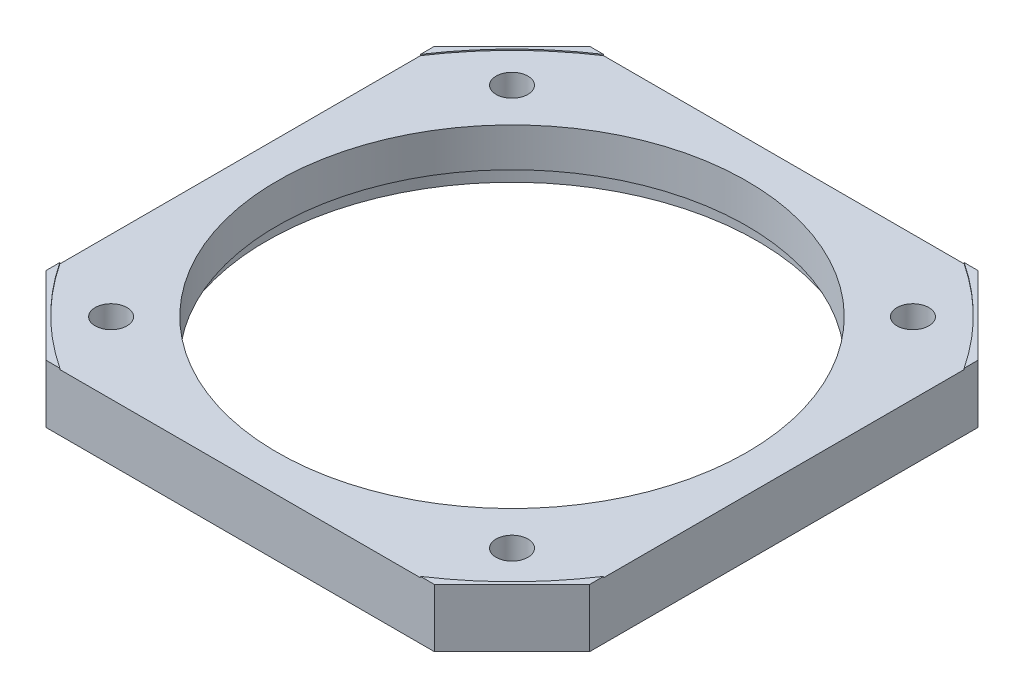
ISO-10303-21;
HEADER;
FILE_DESCRIPTION(('STEP AP214'),'2;1');
FILE_NAME('part.step','',(''),(''),'','','');
FILE_SCHEMA(('AUTOMOTIVE_DESIGN { 1 0 10303 214 1 1 1 1 }'));
ENDSEC;
DATA;
#1=APPLICATION_CONTEXT('core data for automotive mechanical design processes');
#2=APPLICATION_PROTOCOL_DEFINITION('international standard','automotive_design',2000,#1);
#3=PRODUCT_CONTEXT('',#1,'mechanical');
#4=PRODUCT('Part','Part','',(#3));
#5=PRODUCT_RELATED_PRODUCT_CATEGORY('part','',(#4));
#6=PRODUCT_DEFINITION_FORMATION('','',#4);
#7=PRODUCT_DEFINITION_CONTEXT('part definition',#1,'design');
#8=PRODUCT_DEFINITION('design','',#6,#7);
#9=PRODUCT_DEFINITION_SHAPE('','',#8);
#10=(LENGTH_UNIT() NAMED_UNIT(*) SI_UNIT(.MILLI.,.METRE.));
#11=(NAMED_UNIT(*) PLANE_ANGLE_UNIT() SI_UNIT($,.RADIAN.));
#12=(NAMED_UNIT(*) SI_UNIT($,.STERADIAN.) SOLID_ANGLE_UNIT());
#13=UNCERTAINTY_MEASURE_WITH_UNIT(LENGTH_MEASURE(1.E-05),#10,'distance_accuracy_value','');
#14=(GEOMETRIC_REPRESENTATION_CONTEXT(3) GLOBAL_UNCERTAINTY_ASSIGNED_CONTEXT((#13)) GLOBAL_UNIT_ASSIGNED_CONTEXT((#10,
#11,#12)) REPRESENTATION_CONTEXT('',''));
#15=CARTESIAN_POINT('',(0.,0.,0.));
#16=DIRECTION('',(0.,0.,1.));
#17=DIRECTION('',(1.,0.,0.));
#18=AXIS2_PLACEMENT_3D('',#15,#16,#17);
#19=CARTESIAN_POINT('',(144.,-7.2,-60.));
#20=DIRECTION('',(0.707106781186548,0.,-0.707106781186548));
#21=DIRECTION('',(0.,-1.,0.));
#22=AXIS2_PLACEMENT_3D('',#19,#20,#21);
#23=PLANE('',#22);
#24=DIRECTION('',(0.707106781186548,0.,0.707106781186548));
#25=VECTOR('',#24,1.);
#26=CARTESIAN_POINT('',(134.,-14.7,-70.));
#27=LINE('',#26,#25);
#28=CARTESIAN_POINT('',(134.,-14.7,-70.));
#29=VERTEX_POINT('',#28);
#30=CARTESIAN_POINT('',(154.,-14.7,-50.));
#31=VERTEX_POINT('',#30);
#32=EDGE_CURVE('E484',#29,#31,#27,.T.);
#33=ORIENTED_EDGE('',*,*,#32,.F.);
#34=DIRECTION('',(0.,-1.,0.));
#35=VECTOR('',#34,1.);
#36=CARTESIAN_POINT('',(134.,0.3,-70.));
#37=LINE('',#36,#35);
#38=CARTESIAN_POINT('',(134.,0.3,-70.));
#39=VERTEX_POINT('',#38);
#40=EDGE_CURVE('E335',#39,#29,#37,.T.);
#41=ORIENTED_EDGE('',*,*,#40,.F.);
#42=DIRECTION('',(-0.707106781186548,0.,-0.707106781186548));
#43=VECTOR('',#42,1.);
#44=CARTESIAN_POINT('',(154.,0.3,-50.));
#45=LINE('',#44,#43);
#46=CARTESIAN_POINT('',(154.,0.3,-50.));
#47=VERTEX_POINT('',#46);
#48=EDGE_CURVE('E352',#47,#39,#45,.T.);
#49=ORIENTED_EDGE('',*,*,#48,.F.);
#50=DIRECTION('',(0.,-1.,0.));
#51=VECTOR('',#50,1.);
#52=CARTESIAN_POINT('',(154.,0.3,-50.));
#53=LINE('',#52,#51);
#54=EDGE_CURVE('E28',#47,#31,#53,.T.);
#55=ORIENTED_EDGE('',*,*,#54,.T.);
#56=EDGE_LOOP('',(#33,#41,#49,#55));
#57=FACE_BOUND('',#56,.T.);
#58=ADVANCED_FACE('F17',(#57),#23,.T.);
#59=CARTESIAN_POINT('',(84.,-14.7,0.));
#60=DIRECTION('',(0.,1.,0.));
#61=DIRECTION('',(0.,0.,1.));
#62=AXIS2_PLACEMENT_3D('',#59,#60,#61);
#63=CYLINDRICAL_SURFACE('',#62,84.);
#64=CARTESIAN_POINT('',(84.,0.,0.));
#65=DIRECTION('',(0.,1.,0.));
#66=DIRECTION('',(0.833333333333308,0.,-0.552770798392605));
#67=AXIS2_PLACEMENT_3D('',#64,#65,#66);
#68=CIRCLE('',#67,84.);
#69=CARTESIAN_POINT('',(154.,0.,-46.43274706498));
#70=VERTEX_POINT('',#69);
#71=CARTESIAN_POINT('',(130.432747065,0.,-70.));
#72=VERTEX_POINT('',#71);
#73=EDGE_CURVE('E336',#70,#72,#68,.T.);
#74=ORIENTED_EDGE('',*,*,#73,.F.);
#75=DIRECTION('',(0.,1.,0.));
#76=VECTOR('',#75,1.);
#77=CARTESIAN_POINT('',(154.,0.,-46.43274706498));
#78=LINE('',#77,#76);
#79=CARTESIAN_POINT('',(154.,0.3,-46.43274706498));
#80=VERTEX_POINT('',#79);
#81=EDGE_CURVE('E11',#70,#80,#78,.T.);
#82=ORIENTED_EDGE('',*,*,#81,.T.);
#83=CARTESIAN_POINT('',(84.,0.3,0.));
#84=DIRECTION('',(0.,-1.,0.));
#85=DIRECTION('',(0.552770798392605,0.,-0.833333333333308));
#86=AXIS2_PLACEMENT_3D('',#83,#84,#85);
#87=CIRCLE('',#86,84.);
#88=CARTESIAN_POINT('',(130.432747065,0.3,-70.));
#89=VERTEX_POINT('',#88);
#90=EDGE_CURVE('E499',#89,#80,#87,.T.);
#91=ORIENTED_EDGE('',*,*,#90,.F.);
#92=DIRECTION('',(0.,1.,0.));
#93=VECTOR('',#92,1.);
#94=CARTESIAN_POINT('',(130.432747065,0.,-70.));
#95=LINE('',#94,#93);
#96=EDGE_CURVE('E417',#72,#89,#95,.T.);
#97=ORIENTED_EDGE('',*,*,#96,.F.);
#98=EDGE_LOOP('',(#74,#82,#91,#97));
#99=FACE_BOUND('',#98,.T.);
#100=ADVANCED_FACE('F912',(#99),#63,.F.);
#101=CARTESIAN_POINT('',(144.,-7.2,60.));
#102=DIRECTION('',(0.707106781186548,0.,0.707106781186548));
#103=DIRECTION('',(0.,-1.,0.));
#104=AXIS2_PLACEMENT_3D('',#101,#102,#103);
#105=PLANE('',#104);
#106=DIRECTION('',(-0.707106781186548,0.,0.707106781186548));
#107=VECTOR('',#106,1.);
#108=CARTESIAN_POINT('',(154.,-14.7,50.));
#109=LINE('',#108,#107);
#110=CARTESIAN_POINT('',(154.,-14.7,50.));
#111=VERTEX_POINT('',#110);
#112=CARTESIAN_POINT('',(134.,-14.7,70.));
#113=VERTEX_POINT('',#112);
#114=EDGE_CURVE('E383',#111,#113,#109,.T.);
#115=ORIENTED_EDGE('',*,*,#114,.F.);
#116=DIRECTION('',(0.,-1.,0.));
#117=VECTOR('',#116,1.);
#118=CARTESIAN_POINT('',(154.,0.3,50.));
#119=LINE('',#118,#117);
#120=CARTESIAN_POINT('',(154.,0.3,50.));
#121=VERTEX_POINT('',#120);
#122=EDGE_CURVE('E400',#121,#111,#119,.T.);
#123=ORIENTED_EDGE('',*,*,#122,.F.);
#124=DIRECTION('',(0.707106781186548,0.,-0.707106781186548));
#125=VECTOR('',#124,1.);
#126=CARTESIAN_POINT('',(134.,0.3,70.));
#127=LINE('',#126,#125);
#128=CARTESIAN_POINT('',(134.,0.3,70.));
#129=VERTEX_POINT('',#128);
#130=EDGE_CURVE('E326',#129,#121,#127,.T.);
#131=ORIENTED_EDGE('',*,*,#130,.F.);
#132=DIRECTION('',(0.,-1.,0.));
#133=VECTOR('',#132,1.);
#134=CARTESIAN_POINT('',(134.,0.3,70.));
#135=LINE('',#134,#133);
#136=EDGE_CURVE('E348',#129,#113,#135,.T.);
#137=ORIENTED_EDGE('',*,*,#136,.T.);
#138=EDGE_LOOP('',(#115,#123,#131,#137));
#139=FACE_BOUND('',#138,.T.);
#140=ADVANCED_FACE('F907',(#139),#105,.T.);
#141=CARTESIAN_POINT('',(154.,0.,-46.43274706498));
#142=DIRECTION('',(-1.,0.,0.));
#143=DIRECTION('',(0.,0.,1.));
#144=AXIS2_PLACEMENT_3D('',#141,#142,#143);
#145=PLANE('',#144);
#146=ORIENTED_EDGE('',*,*,#122,.T.);
#147=DIRECTION('',(0.,0.,1.));
#148=VECTOR('',#147,1.);
#149=CARTESIAN_POINT('',(154.,-14.7,-50.));
#150=LINE('',#149,#148);
#151=EDGE_CURVE('E387',#31,#111,#150,.T.);
#152=ORIENTED_EDGE('',*,*,#151,.F.);
#153=ORIENTED_EDGE('',*,*,#54,.F.);
#154=DIRECTION('',(0.,0.,-1.));
#155=VECTOR('',#154,1.);
#156=CARTESIAN_POINT('',(154.,0.3,-46.43274706498));
#157=LINE('',#156,#155);
#158=EDGE_CURVE('E300',#80,#47,#157,.T.);
#159=ORIENTED_EDGE('',*,*,#158,.F.);
#160=ORIENTED_EDGE('',*,*,#81,.F.);
#161=DIRECTION('',(0.,0.,1.));
#162=VECTOR('',#161,1.);
#163=CARTESIAN_POINT('',(154.,0.,-46.43274706498));
#164=LINE('',#163,#162);
#165=CARTESIAN_POINT('',(154.,0.,46.43274706498));
#166=VERTEX_POINT('',#165);
#167=EDGE_CURVE('E340',#70,#166,#164,.T.);
#168=ORIENTED_EDGE('',*,*,#167,.T.);
#169=DIRECTION('',(0.,1.,0.));
#170=VECTOR('',#169,1.);
#171=CARTESIAN_POINT('',(154.,0.,46.43274706498));
#172=LINE('',#171,#170);
#173=CARTESIAN_POINT('',(154.,0.3,46.43274706498));
#174=VERTEX_POINT('',#173);
#175=EDGE_CURVE('E403',#166,#174,#172,.T.);
#176=ORIENTED_EDGE('',*,*,#175,.T.);
#177=DIRECTION('',(0.,0.,-1.));
#178=VECTOR('',#177,1.);
#179=CARTESIAN_POINT('',(154.,0.3,50.));
#180=LINE('',#179,#178);
#181=EDGE_CURVE('E325',#121,#174,#180,.T.);
#182=ORIENTED_EDGE('',*,*,#181,.F.);
#183=EDGE_LOOP('',(#146,#152,#153,#159,#160,#168,#176,#182));
#184=FACE_BOUND('',#183,.T.);
#185=ADVANCED_FACE('F876',(#184),#145,.F.);
#186=CARTESIAN_POINT('',(84.,-14.7,0.));
#187=DIRECTION('',(0.,1.,0.));
#188=DIRECTION('',(0.,0.,1.));
#189=AXIS2_PLACEMENT_3D('',#186,#187,#188);
#190=CYLINDRICAL_SURFACE('',#189,84.);
#191=CARTESIAN_POINT('',(84.,0.,0.));
#192=DIRECTION('',(0.,1.,0.));
#193=DIRECTION('',(0.552770798392605,0.,0.833333333333308));
#194=AXIS2_PLACEMENT_3D('',#191,#192,#193);
#195=CIRCLE('',#194,84.);
#196=CARTESIAN_POINT('',(130.432747065,0.,70.));
#197=VERTEX_POINT('',#196);
#198=EDGE_CURVE('E503',#197,#166,#195,.T.);
#199=ORIENTED_EDGE('',*,*,#198,.F.);
#200=DIRECTION('',(0.,1.,0.));
#201=VECTOR('',#200,1.);
#202=CARTESIAN_POINT('',(130.432747065,0.,70.));
#203=LINE('',#202,#201);
#204=CARTESIAN_POINT('',(130.432747065,0.3,70.));
#205=VERTEX_POINT('',#204);
#206=EDGE_CURVE('E382',#197,#205,#203,.T.);
#207=ORIENTED_EDGE('',*,*,#206,.T.);
#208=CARTESIAN_POINT('',(84.,0.3,0.));
#209=DIRECTION('',(0.,-1.,0.));
#210=DIRECTION('',(0.833333333333308,0.,0.552770798392605));
#211=AXIS2_PLACEMENT_3D('',#208,#209,#210);
#212=CIRCLE('',#211,84.);
#213=EDGE_CURVE('E320',#174,#205,#212,.T.);
#214=ORIENTED_EDGE('',*,*,#213,.F.);
#215=ORIENTED_EDGE('',*,*,#175,.F.);
#216=EDGE_LOOP('',(#199,#207,#214,#215));
#217=FACE_BOUND('',#216,.T.);
#218=ADVANCED_FACE('F870',(#217),#190,.F.);
#219=CARTESIAN_POINT('',(24.,-7.2,60.));
#220=DIRECTION('',(-0.707106781186548,0.,0.707106781186548));
#221=DIRECTION('',(0.,1.,0.));
#222=AXIS2_PLACEMENT_3D('',#219,#220,#221);
#223=PLANE('',#222);
#224=DIRECTION('',(-0.707106781186548,0.,-0.707106781186548));
#225=VECTOR('',#224,1.);
#226=CARTESIAN_POINT('',(34.,-14.7,70.));
#227=LINE('',#226,#225);
#228=CARTESIAN_POINT('',(34.,-14.7,70.));
#229=VERTEX_POINT('',#228);
#230=CARTESIAN_POINT('',(14.,-14.7,50.));
#231=VERTEX_POINT('',#230);
#232=EDGE_CURVE('E366',#229,#231,#227,.T.);
#233=ORIENTED_EDGE('',*,*,#232,.F.);
#234=DIRECTION('',(0.,-1.,0.));
#235=VECTOR('',#234,1.);
#236=CARTESIAN_POINT('',(34.,0.3,70.));
#237=LINE('',#236,#235);
#238=CARTESIAN_POINT('',(34.,0.3,70.));
#239=VERTEX_POINT('',#238);
#240=EDGE_CURVE('E344',#239,#229,#237,.T.);
#241=ORIENTED_EDGE('',*,*,#240,.F.);
#242=DIRECTION('',(0.707106781186548,0.,0.707106781186548));
#243=VECTOR('',#242,1.);
#244=CARTESIAN_POINT('',(14.,0.3,50.));
#245=LINE('',#244,#243);
#246=CARTESIAN_POINT('',(14.,0.3,50.));
#247=VERTEX_POINT('',#246);
#248=EDGE_CURVE('E375',#247,#239,#245,.T.);
#249=ORIENTED_EDGE('',*,*,#248,.F.);
#250=DIRECTION('',(0.,-1.,0.));
#251=VECTOR('',#250,1.);
#252=CARTESIAN_POINT('',(14.,0.3,50.));
#253=LINE('',#252,#251);
#254=EDGE_CURVE('E299',#247,#231,#253,.T.);
#255=ORIENTED_EDGE('',*,*,#254,.T.);
#256=EDGE_LOOP('',(#233,#241,#249,#255));
#257=FACE_BOUND('',#256,.T.);
#258=ADVANCED_FACE('F875',(#257),#223,.T.);
#259=CARTESIAN_POINT('',(130.432747065,0.,70.));
#260=DIRECTION('',(0.,0.,-1.));
#261=DIRECTION('',(0.,-1.,0.));
#262=AXIS2_PLACEMENT_3D('',#259,#260,#261);
#263=PLANE('',#262);
#264=ORIENTED_EDGE('',*,*,#240,.T.);
#265=DIRECTION('',(-1.,0.,0.));
#266=VECTOR('',#265,1.);
#267=CARTESIAN_POINT('',(134.,-14.7,70.));
#268=LINE('',#267,#266);
#269=EDGE_CURVE('E371',#113,#229,#268,.T.);
#270=ORIENTED_EDGE('',*,*,#269,.F.);
#271=ORIENTED_EDGE('',*,*,#136,.F.);
#272=DIRECTION('',(1.,0.,0.));
#273=VECTOR('',#272,1.);
#274=CARTESIAN_POINT('',(130.432747065,0.3,70.));
#275=LINE('',#274,#273);
#276=EDGE_CURVE('E324',#205,#129,#275,.T.);
#277=ORIENTED_EDGE('',*,*,#276,.F.);
#278=ORIENTED_EDGE('',*,*,#206,.F.);
#279=DIRECTION('',(-1.,0.,0.));
#280=VECTOR('',#279,1.);
#281=CARTESIAN_POINT('',(130.432747065,0.,70.));
#282=LINE('',#281,#280);
#283=CARTESIAN_POINT('',(37.56725293502,0.,70.));
#284=VERTEX_POINT('',#283);
#285=EDGE_CURVE('E294',#197,#284,#282,.T.);
#286=ORIENTED_EDGE('',*,*,#285,.T.);
#287=DIRECTION('',(0.,1.,0.));
#288=VECTOR('',#287,1.);
#289=CARTESIAN_POINT('',(37.56725293502,0.,70.));
#290=LINE('',#289,#288);
#291=CARTESIAN_POINT('',(37.56725293502,0.3,70.));
#292=VERTEX_POINT('',#291);
#293=EDGE_CURVE('E74',#284,#292,#290,.T.);
#294=ORIENTED_EDGE('',*,*,#293,.T.);
#295=DIRECTION('',(1.,0.,0.));
#296=VECTOR('',#295,1.);
#297=CARTESIAN_POINT('',(34.,0.3,70.));
#298=LINE('',#297,#296);
#299=EDGE_CURVE('E394',#239,#292,#298,.T.);
#300=ORIENTED_EDGE('',*,*,#299,.F.);
#301=EDGE_LOOP('',(#264,#270,#271,#277,#278,#286,#294,#300));
#302=FACE_BOUND('',#301,.T.);
#303=ADVANCED_FACE('F932',(#302),#263,.F.);
#304=CARTESIAN_POINT('',(84.,-14.7,0.));
#305=DIRECTION('',(0.,1.,0.));
#306=DIRECTION('',(0.,0.,1.));
#307=AXIS2_PLACEMENT_3D('',#304,#305,#306);
#308=CYLINDRICAL_SURFACE('',#307,84.);
#309=CARTESIAN_POINT('',(84.,0.,0.));
#310=DIRECTION('',(0.,1.,0.));
#311=DIRECTION('',(-0.833333333333308,0.,0.552770798392605));
#312=AXIS2_PLACEMENT_3D('',#309,#310,#311);
#313=CIRCLE('',#312,84.);
#314=CARTESIAN_POINT('',(14.,0.,46.43274706498));
#315=VERTEX_POINT('',#314);
#316=EDGE_CURVE('E432',#315,#284,#313,.T.);
#317=ORIENTED_EDGE('',*,*,#316,.F.);
#318=DIRECTION('',(0.,1.,0.));
#319=VECTOR('',#318,1.);
#320=CARTESIAN_POINT('',(14.,0.,46.43274706498));
#321=LINE('',#320,#319);
#322=CARTESIAN_POINT('',(14.,0.3,46.43274706498));
#323=VERTEX_POINT('',#322);
#324=EDGE_CURVE('E90',#315,#323,#321,.T.);
#325=ORIENTED_EDGE('',*,*,#324,.T.);
#326=CARTESIAN_POINT('',(84.,0.3,0.));
#327=DIRECTION('',(0.,-1.,0.));
#328=DIRECTION('',(-0.552770798392605,0.,0.833333333333308));
#329=AXIS2_PLACEMENT_3D('',#326,#327,#328);
#330=CIRCLE('',#329,84.);
#331=EDGE_CURVE('E21',#292,#323,#330,.T.);
#332=ORIENTED_EDGE('',*,*,#331,.F.);
#333=ORIENTED_EDGE('',*,*,#293,.F.);
#334=EDGE_LOOP('',(#317,#325,#332,#333));
#335=FACE_BOUND('',#334,.T.);
#336=ADVANCED_FACE('F937',(#335),#308,.F.);
#337=CARTESIAN_POINT('',(14.,0.,46.43274706498));
#338=DIRECTION('',(1.,0.,0.));
#339=DIRECTION('',(0.,1.,0.));
#340=AXIS2_PLACEMENT_3D('',#337,#338,#339);
#341=PLANE('',#340);
#342=DIRECTION('',(0.,-1.,0.));
#343=VECTOR('',#342,1.);
#344=CARTESIAN_POINT('',(14.,0.3,-50.));
#345=LINE('',#344,#343);
#346=CARTESIAN_POINT('',(14.,0.3,-50.));
#347=VERTEX_POINT('',#346);
#348=CARTESIAN_POINT('',(14.,-14.7,-50.));
#349=VERTEX_POINT('',#348);
#350=EDGE_CURVE('E331',#347,#349,#345,.T.);
#351=ORIENTED_EDGE('',*,*,#350,.T.);
#352=DIRECTION('',(0.,0.,-1.));
#353=VECTOR('',#352,1.);
#354=CARTESIAN_POINT('',(14.,-14.7,50.));
#355=LINE('',#354,#353);
#356=EDGE_CURVE('E370',#231,#349,#355,.T.);
#357=ORIENTED_EDGE('',*,*,#356,.F.);
#358=ORIENTED_EDGE('',*,*,#254,.F.);
#359=DIRECTION('',(0.,0.,1.));
#360=VECTOR('',#359,1.);
#361=CARTESIAN_POINT('',(14.,0.3,46.43274706498));
#362=LINE('',#361,#360);
#363=EDGE_CURVE('E330',#323,#247,#362,.T.);
#364=ORIENTED_EDGE('',*,*,#363,.F.);
#365=ORIENTED_EDGE('',*,*,#324,.F.);
#366=DIRECTION('',(0.,0.,-1.));
#367=VECTOR('',#366,1.);
#368=CARTESIAN_POINT('',(14.,0.,46.43274706498));
#369=LINE('',#368,#367);
#370=CARTESIAN_POINT('',(14.,0.,-46.43274706498));
#371=VERTEX_POINT('',#370);
#372=EDGE_CURVE('E409',#315,#371,#369,.T.);
#373=ORIENTED_EDGE('',*,*,#372,.T.);
#374=DIRECTION('',(0.,1.,0.));
#375=VECTOR('',#374,1.);
#376=CARTESIAN_POINT('',(14.,0.,-46.43274706498));
#377=LINE('',#376,#375);
#378=CARTESIAN_POINT('',(14.,0.3,-46.43274706498));
#379=VERTEX_POINT('',#378);
#380=EDGE_CURVE('E296',#371,#379,#377,.T.);
#381=ORIENTED_EDGE('',*,*,#380,.T.);
#382=DIRECTION('',(0.,0.,1.));
#383=VECTOR('',#382,1.);
#384=CARTESIAN_POINT('',(14.,0.3,-50.));
#385=LINE('',#384,#383);
#386=EDGE_CURVE('E376',#347,#379,#385,.T.);
#387=ORIENTED_EDGE('',*,*,#386,.F.);
#388=EDGE_LOOP('',(#351,#357,#358,#364,#365,#373,#381,#387));
#389=FACE_BOUND('',#388,.T.);
#390=ADVANCED_FACE('F845',(#389),#341,.F.);
#391=CARTESIAN_POINT('',(84.,-14.7,0.));
#392=DIRECTION('',(0.,1.,0.));
#393=DIRECTION('',(0.,0.,1.));
#394=AXIS2_PLACEMENT_3D('',#391,#392,#393);
#395=CYLINDRICAL_SURFACE('',#394,84.);
#396=CARTESIAN_POINT('',(84.,0.,0.));
#397=DIRECTION('',(0.,1.,0.));
#398=DIRECTION('',(-0.552770798392605,0.,-0.833333333333308));
#399=AXIS2_PLACEMENT_3D('',#396,#397,#398);
#400=CIRCLE('',#399,84.);
#401=CARTESIAN_POINT('',(37.56725293502,0.,-70.));
#402=VERTEX_POINT('',#401);
#403=EDGE_CURVE('E362',#402,#371,#400,.T.);
#404=ORIENTED_EDGE('',*,*,#403,.F.);
#405=DIRECTION('',(0.,1.,0.));
#406=VECTOR('',#405,1.);
#407=CARTESIAN_POINT('',(37.56725293502,0.,-70.));
#408=LINE('',#407,#406);
#409=CARTESIAN_POINT('',(37.56725293502,0.3,-70.));
#410=VERTEX_POINT('',#409);
#411=EDGE_CURVE('E413',#402,#410,#408,.T.);
#412=ORIENTED_EDGE('',*,*,#411,.T.);
#413=CARTESIAN_POINT('',(84.,0.3,0.));
#414=DIRECTION('',(0.,-1.,0.));
#415=DIRECTION('',(-0.833333333333308,0.,-0.552770798392605));
#416=AXIS2_PLACEMENT_3D('',#413,#414,#415);
#417=CIRCLE('',#416,84.);
#418=EDGE_CURVE('E372',#379,#410,#417,.T.);
#419=ORIENTED_EDGE('',*,*,#418,.F.);
#420=ORIENTED_EDGE('',*,*,#380,.F.);
#421=EDGE_LOOP('',(#404,#412,#419,#420));
#422=FACE_BOUND('',#421,.T.);
#423=ADVANCED_FACE('F840',(#422),#395,.F.);
#424=CARTESIAN_POINT('',(84.,0.3,0.));
#425=DIRECTION('',(0.,1.,0.));
#426=DIRECTION('',(1.,0.,0.));
#427=AXIS2_PLACEMENT_3D('',#424,#425,#426);
#428=PLANE('',#427);
#429=ORIENTED_EDGE('',*,*,#48,.T.);
#430=DIRECTION('',(-1.,0.,0.));
#431=VECTOR('',#430,1.);
#432=CARTESIAN_POINT('',(134.,0.3,-70.));
#433=LINE('',#432,#431);
#434=EDGE_CURVE('E390',#39,#89,#433,.T.);
#435=ORIENTED_EDGE('',*,*,#434,.T.);
#436=ORIENTED_EDGE('',*,*,#90,.T.);
#437=ORIENTED_EDGE('',*,*,#158,.T.);
#438=EDGE_LOOP('',(#429,#435,#436,#437));
#439=FACE_BOUND('',#438,.T.);
#440=ADVANCED_FACE('F795',(#439),#428,.T.);
#441=CARTESIAN_POINT('',(84.,0.3,0.));
#442=DIRECTION('',(0.,1.,0.));
#443=DIRECTION('',(1.,0.,0.));
#444=AXIS2_PLACEMENT_3D('',#441,#442,#443);
#445=PLANE('',#444);
#446=ORIENTED_EDGE('',*,*,#130,.T.);
#447=ORIENTED_EDGE('',*,*,#181,.T.);
#448=ORIENTED_EDGE('',*,*,#213,.T.);
#449=ORIENTED_EDGE('',*,*,#276,.T.);
#450=EDGE_LOOP('',(#446,#447,#448,#449));
#451=FACE_BOUND('',#450,.T.);
#452=ADVANCED_FACE('F789',(#451),#445,.T.);
#453=CARTESIAN_POINT('',(84.,0.3,0.));
#454=DIRECTION('',(0.,1.,0.));
#455=DIRECTION('',(1.,0.,0.));
#456=AXIS2_PLACEMENT_3D('',#453,#454,#455);
#457=PLANE('',#456);
#458=ORIENTED_EDGE('',*,*,#248,.T.);
#459=ORIENTED_EDGE('',*,*,#299,.T.);
#460=ORIENTED_EDGE('',*,*,#331,.T.);
#461=ORIENTED_EDGE('',*,*,#363,.T.);
#462=EDGE_LOOP('',(#458,#459,#460,#461));
#463=FACE_BOUND('',#462,.T.);
#464=ADVANCED_FACE('F794',(#463),#457,.T.);
#465=CARTESIAN_POINT('',(84.,0.3,0.));
#466=DIRECTION('',(0.,1.,0.));
#467=DIRECTION('',(1.,0.,0.));
#468=AXIS2_PLACEMENT_3D('',#465,#466,#467);
#469=PLANE('',#468);
#470=DIRECTION('',(-0.707106781186548,0.,0.707106781186548));
#471=VECTOR('',#470,1.);
#472=CARTESIAN_POINT('',(34.,0.3,-70.));
#473=LINE('',#472,#471);
#474=CARTESIAN_POINT('',(34.,0.3,-70.));
#475=VERTEX_POINT('',#474);
#476=EDGE_CURVE('E334',#475,#347,#473,.T.);
#477=ORIENTED_EDGE('',*,*,#476,.T.);
#478=ORIENTED_EDGE('',*,*,#386,.T.);
#479=ORIENTED_EDGE('',*,*,#418,.T.);
#480=DIRECTION('',(-1.,0.,0.));
#481=VECTOR('',#480,1.);
#482=CARTESIAN_POINT('',(37.56725293502,0.3,-70.));
#483=LINE('',#482,#481);
#484=EDGE_CURVE('E418',#410,#475,#483,.T.);
#485=ORIENTED_EDGE('',*,*,#484,.T.);
#486=EDGE_LOOP('',(#477,#478,#479,#485));
#487=FACE_BOUND('',#486,.T.);
#488=ADVANCED_FACE('F812',(#487),#469,.T.);
#489=CARTESIAN_POINT('',(24.,-7.2,-60.));
#490=DIRECTION('',(-0.707106781186548,0.,-0.707106781186548));
#491=DIRECTION('',(-0.707106781186548,0.,0.707106781186548));
#492=AXIS2_PLACEMENT_3D('',#489,#490,#491);
#493=PLANE('',#492);
#494=DIRECTION('',(0.707106781186548,0.,-0.707106781186548));
#495=VECTOR('',#494,1.);
#496=CARTESIAN_POINT('',(14.,-14.7,-50.));
#497=LINE('',#496,#495);
#498=CARTESIAN_POINT('',(34.,-14.7,-70.));
#499=VERTEX_POINT('',#498);
#500=EDGE_CURVE('E395',#349,#499,#497,.T.);
#501=ORIENTED_EDGE('',*,*,#500,.F.);
#502=ORIENTED_EDGE('',*,*,#350,.F.);
#503=ORIENTED_EDGE('',*,*,#476,.F.);
#504=DIRECTION('',(0.,-1.,0.));
#505=VECTOR('',#504,1.);
#506=CARTESIAN_POINT('',(34.,0.3,-70.));
#507=LINE('',#506,#505);
#508=EDGE_CURVE('E272',#475,#499,#507,.T.);
#509=ORIENTED_EDGE('',*,*,#508,.T.);
#510=EDGE_LOOP('',(#501,#502,#503,#509));
#511=FACE_BOUND('',#510,.T.);
#512=ADVANCED_FACE('F817',(#511),#493,.T.);
#513=CARTESIAN_POINT('',(37.56725293502,0.,-70.));
#514=DIRECTION('',(0.,0.,1.));
#515=DIRECTION('',(1.,0.,0.));
#516=AXIS2_PLACEMENT_3D('',#513,#514,#515);
#517=PLANE('',#516);
#518=ORIENTED_EDGE('',*,*,#508,.F.);
#519=ORIENTED_EDGE('',*,*,#484,.F.);
#520=ORIENTED_EDGE('',*,*,#411,.F.);
#521=DIRECTION('',(1.,0.,0.));
#522=VECTOR('',#521,1.);
#523=CARTESIAN_POINT('',(37.56725293502,0.,-70.));
#524=LINE('',#523,#522);
#525=EDGE_CURVE('E358',#402,#72,#524,.T.);
#526=ORIENTED_EDGE('',*,*,#525,.T.);
#527=ORIENTED_EDGE('',*,*,#96,.T.);
#528=ORIENTED_EDGE('',*,*,#434,.F.);
#529=ORIENTED_EDGE('',*,*,#40,.T.);
#530=DIRECTION('',(1.,0.,0.));
#531=VECTOR('',#530,1.);
#532=CARTESIAN_POINT('',(34.,-14.7,-70.));
#533=LINE('',#532,#531);
#534=EDGE_CURVE('E399',#499,#29,#533,.T.);
#535=ORIENTED_EDGE('',*,*,#534,.F.);
#536=EDGE_LOOP('',(#518,#519,#520,#526,#527,#528,#529,#535));
#537=FACE_BOUND('',#536,.T.);
#538=ADVANCED_FACE('F19',(#537),#517,.F.);
#539=CARTESIAN_POINT('',(32.38120497338,-14.7,-51.61879502662));
#540=DIRECTION('',(0.,1.,0.));
#541=DIRECTION('',(-1.,0.,0.));
#542=AXIS2_PLACEMENT_3D('',#539,#540,#541);
#543=CYLINDRICAL_SURFACE('',#542,6.5);
#544=CARTESIAN_POINT('',(32.38120497338,-14.7,-51.61879502662));
#545=DIRECTION('',(0.,1.,0.));
#546=DIRECTION('',(-1.,0.,0.));
#547=AXIS2_PLACEMENT_3D('',#544,#545,#546);
#548=CIRCLE('',#547,6.5);
#549=CARTESIAN_POINT('',(38.88120497338,-14.7,-51.61879502662));
#550=VERTEX_POINT('',#549);
#551=EDGE_CURVE('E268',#550,#550,#548,.T.);
#552=ORIENTED_EDGE('',*,*,#551,.F.);
#553=DIRECTION('',(0.,1.,0.));
#554=VECTOR('',#553,1.);
#555=CARTESIAN_POINT('',(38.88120497338,-14.7,-51.61879502662));
#556=LINE('',#555,#554);
#557=CARTESIAN_POINT('',(38.88120497338,-6.7,-51.61879502662));
#558=VERTEX_POINT('',#557);
#559=EDGE_CURVE('E265',#550,#558,#556,.T.);
#560=ORIENTED_EDGE('',*,*,#559,.T.);
#561=CARTESIAN_POINT('',(32.38120497338,-6.7,-51.61879502662));
#562=DIRECTION('',(0.,1.,0.));
#563=DIRECTION('',(-1.,0.,0.));
#564=AXIS2_PLACEMENT_3D('',#561,#562,#563);
#565=CIRCLE('',#564,6.5);
#566=EDGE_CURVE('E270',#558,#558,#565,.T.);
#567=ORIENTED_EDGE('',*,*,#566,.T.);
#568=ORIENTED_EDGE('',*,*,#559,.F.);
#569=EDGE_LOOP('',(#552,#560,#567,#568));
#570=FACE_BOUND('',#569,.T.);
#571=ADVANCED_FACE('F267',(#570),#543,.F.);
#572=CARTESIAN_POINT('',(32.38120497338,-6.7,-51.61879502662));
#573=DIRECTION('',(0.,1.,0.));
#574=DIRECTION('',(1.,0.,0.));
#575=AXIS2_PLACEMENT_3D('',#572,#573,#574);
#576=PLANE('',#575);
#577=CARTESIAN_POINT('',(32.38120497338,-6.7,-51.61879502662));
#578=DIRECTION('',(0.,-1.,0.));
#579=DIRECTION('',(1.,0.,0.));
#580=AXIS2_PLACEMENT_3D('',#577,#578,#579);
#581=CIRCLE('',#580,4.1);
#582=CARTESIAN_POINT('',(28.28120497338,-6.7,-51.61879502662));
#583=VERTEX_POINT('',#582);
#584=EDGE_CURVE('E164',#583,#583,#581,.T.);
#585=ORIENTED_EDGE('',*,*,#584,.F.);
#586=EDGE_LOOP('',(#585));
#587=FACE_BOUND('',#586,.T.);
#588=ORIENTED_EDGE('',*,*,#566,.F.);
#589=EDGE_LOOP('',(#588));
#590=FACE_BOUND('',#589,.T.);
#591=ADVANCED_FACE('F783',(#587,#590),#576,.F.);
#592=CARTESIAN_POINT('',(32.38120497338,0.,-51.61879502662));
#593=DIRECTION('',(0.,-1.,0.));
#594=DIRECTION('',(1.,0.,0.));
#595=AXIS2_PLACEMENT_3D('',#592,#593,#594);
#596=CYLINDRICAL_SURFACE('',#595,4.1);
#597=CARTESIAN_POINT('',(32.38120497338,0.,-51.61879502662));
#598=DIRECTION('',(0.,-1.,0.));
#599=DIRECTION('',(1.,0.,0.));
#600=AXIS2_PLACEMENT_3D('',#597,#598,#599);
#601=CIRCLE('',#600,4.1);
#602=CARTESIAN_POINT('',(28.28120497338,0.,-51.61879502662));
#603=VERTEX_POINT('',#602);
#604=EDGE_CURVE('E488',#603,#603,#601,.T.);
#605=ORIENTED_EDGE('',*,*,#604,.F.);
#606=DIRECTION('',(0.,-1.,0.));
#607=VECTOR('',#606,1.);
#608=CARTESIAN_POINT('',(28.28120497338,0.,-51.61879502662));
#609=LINE('',#608,#607);
#610=EDGE_CURVE('E131',#603,#583,#609,.T.);
#611=ORIENTED_EDGE('',*,*,#610,.T.);
#612=ORIENTED_EDGE('',*,*,#584,.T.);
#613=ORIENTED_EDGE('',*,*,#610,.F.);
#614=EDGE_LOOP('',(#605,#611,#612,#613));
#615=FACE_BOUND('',#614,.T.);
#616=ADVANCED_FACE('F777',(#615),#596,.F.);
#617=CARTESIAN_POINT('',(32.38120497338,-14.7,51.61879502662));
#618=DIRECTION('',(0.,1.,0.));
#619=DIRECTION('',(-1.,0.,0.));
#620=AXIS2_PLACEMENT_3D('',#617,#618,#619);
#621=CYLINDRICAL_SURFACE('',#620,6.5);
#622=CARTESIAN_POINT('',(32.38120497338,-14.7,51.61879502662));
#623=DIRECTION('',(0.,1.,0.));
#624=DIRECTION('',(-1.,0.,0.));
#625=AXIS2_PLACEMENT_3D('',#622,#623,#624);
#626=CIRCLE('',#625,6.5);
#627=CARTESIAN_POINT('',(38.88120497338,-14.7,51.61879502662));
#628=VERTEX_POINT('',#627);
#629=EDGE_CURVE('E279',#628,#628,#626,.T.);
#630=ORIENTED_EDGE('',*,*,#629,.F.);
#631=DIRECTION('',(0.,1.,0.));
#632=VECTOR('',#631,1.);
#633=CARTESIAN_POINT('',(38.88120497338,-14.7,51.61879502662));
#634=LINE('',#633,#632);
#635=CARTESIAN_POINT('',(38.88120497338,-6.7,51.61879502662));
#636=VERTEX_POINT('',#635);
#637=EDGE_CURVE('E156',#628,#636,#634,.T.);
#638=ORIENTED_EDGE('',*,*,#637,.T.);
#639=CARTESIAN_POINT('',(32.38120497338,-6.7,51.61879502662));
#640=DIRECTION('',(0.,1.,0.));
#641=DIRECTION('',(-1.,0.,0.));
#642=AXIS2_PLACEMENT_3D('',#639,#640,#641);
#643=CIRCLE('',#642,6.5);
#644=EDGE_CURVE('E343',#636,#636,#643,.T.);
#645=ORIENTED_EDGE('',*,*,#644,.T.);
#646=ORIENTED_EDGE('',*,*,#637,.F.);
#647=EDGE_LOOP('',(#630,#638,#645,#646));
#648=FACE_BOUND('',#647,.T.);
#649=ADVANCED_FACE('F782',(#648),#621,.F.);
#650=CARTESIAN_POINT('',(32.38120497338,-6.7,51.61879502662));
#651=DIRECTION('',(0.,1.,0.));
#652=DIRECTION('',(1.,0.,0.));
#653=AXIS2_PLACEMENT_3D('',#650,#651,#652);
#654=PLANE('',#653);
#655=CARTESIAN_POINT('',(32.38120497338,-6.7,51.61879502662));
#656=DIRECTION('',(0.,-1.,0.));
#657=DIRECTION('',(1.,0.,0.));
#658=AXIS2_PLACEMENT_3D('',#655,#656,#657);
#659=CIRCLE('',#658,4.1);
#660=CARTESIAN_POINT('',(28.28120497338,-6.7,51.61879502662));
#661=VERTEX_POINT('',#660);
#662=EDGE_CURVE('E312',#661,#661,#659,.T.);
#663=ORIENTED_EDGE('',*,*,#662,.F.);
#664=EDGE_LOOP('',(#663));
#665=FACE_BOUND('',#664,.T.);
#666=ORIENTED_EDGE('',*,*,#644,.F.);
#667=EDGE_LOOP('',(#666));
#668=FACE_BOUND('',#667,.T.);
#669=ADVANCED_FACE('F902',(#665,#668),#654,.F.);
#670=CARTESIAN_POINT('',(32.38120497338,0.,51.61879502662));
#671=DIRECTION('',(0.,-1.,0.));
#672=DIRECTION('',(1.,0.,0.));
#673=AXIS2_PLACEMENT_3D('',#670,#671,#672);
#674=CYLINDRICAL_SURFACE('',#673,4.1);
#675=CARTESIAN_POINT('',(32.38120497338,0.,51.61879502662));
#676=DIRECTION('',(0.,-1.,0.));
#677=DIRECTION('',(1.,0.,0.));
#678=AXIS2_PLACEMENT_3D('',#675,#676,#677);
#679=CIRCLE('',#678,4.1);
#680=CARTESIAN_POINT('',(28.28120497338,0.,51.61879502662));
#681=VERTEX_POINT('',#680);
#682=EDGE_CURVE('E318',#681,#681,#679,.T.);
#683=ORIENTED_EDGE('',*,*,#682,.F.);
#684=DIRECTION('',(0.,-1.,0.));
#685=VECTOR('',#684,1.);
#686=CARTESIAN_POINT('',(28.28120497338,0.,51.61879502662));
#687=LINE('',#686,#685);
#688=EDGE_CURVE('E142',#681,#661,#687,.T.);
#689=ORIENTED_EDGE('',*,*,#688,.T.);
#690=ORIENTED_EDGE('',*,*,#662,.T.);
#691=ORIENTED_EDGE('',*,*,#688,.F.);
#692=EDGE_LOOP('',(#683,#689,#690,#691));
#693=FACE_BOUND('',#692,.T.);
#694=ADVANCED_FACE('F897',(#693),#674,.F.);
#695=CARTESIAN_POINT('',(135.6187950266,-14.7,51.61879502662));
#696=DIRECTION('',(0.,1.,0.));
#697=DIRECTION('',(-1.,0.,0.));
#698=AXIS2_PLACEMENT_3D('',#695,#696,#697);
#699=CYLINDRICAL_SURFACE('',#698,6.5);
#700=CARTESIAN_POINT('',(135.6187950266,-14.7,51.61879502662));
#701=DIRECTION('',(0.,1.,0.));
#702=DIRECTION('',(-1.,0.,0.));
#703=AXIS2_PLACEMENT_3D('',#700,#701,#702);
#704=CIRCLE('',#703,6.5);
#705=CARTESIAN_POINT('',(142.1187950266,-14.7,51.61879502662));
#706=VERTEX_POINT('',#705);
#707=EDGE_CURVE('E290',#706,#706,#704,.T.);
#708=ORIENTED_EDGE('',*,*,#707,.F.);
#709=DIRECTION('',(0.,1.,0.));
#710=VECTOR('',#709,1.);
#711=CARTESIAN_POINT('',(142.1187950266,-14.7,51.61879502662));
#712=LINE('',#711,#710);
#713=CARTESIAN_POINT('',(142.1187950266,-6.7,51.61879502662));
#714=VERTEX_POINT('',#713);
#715=EDGE_CURVE('E313',#706,#714,#712,.T.);
#716=ORIENTED_EDGE('',*,*,#715,.T.);
#717=CARTESIAN_POINT('',(135.6187950266,-6.7,51.61879502662));
#718=DIRECTION('',(0.,1.,0.));
#719=DIRECTION('',(-1.,0.,0.));
#720=AXIS2_PLACEMENT_3D('',#717,#718,#719);
#721=CIRCLE('',#720,6.5);
#722=EDGE_CURVE('E422',#714,#714,#721,.T.);
#723=ORIENTED_EDGE('',*,*,#722,.T.);
#724=ORIENTED_EDGE('',*,*,#715,.F.);
#725=EDGE_LOOP('',(#708,#716,#723,#724));
#726=FACE_BOUND('',#725,.T.);
#727=ADVANCED_FACE('F826',(#726),#699,.F.);
#728=CARTESIAN_POINT('',(135.6187950266,-6.7,51.61879502662));
#729=DIRECTION('',(0.,1.,0.));
#730=DIRECTION('',(1.,0.,0.));
#731=AXIS2_PLACEMENT_3D('',#728,#729,#730);
#732=PLANE('',#731);
#733=CARTESIAN_POINT('',(135.6187950266,-6.7,51.61879502662));
#734=DIRECTION('',(0.,-1.,0.));
#735=DIRECTION('',(1.,0.,0.));
#736=AXIS2_PLACEMENT_3D('',#733,#734,#735);
#737=CIRCLE('',#736,4.1);
#738=CARTESIAN_POINT('',(131.5187950266,-6.7,51.61879502662));
#739=VERTEX_POINT('',#738);
#740=EDGE_CURVE('E426',#739,#739,#737,.T.);
#741=ORIENTED_EDGE('',*,*,#740,.F.);
#742=EDGE_LOOP('',(#741));
#743=FACE_BOUND('',#742,.T.);
#744=ORIENTED_EDGE('',*,*,#722,.F.);
#745=EDGE_LOOP('',(#744));
#746=FACE_BOUND('',#745,.T.);
#747=ADVANCED_FACE('F770',(#743,#746),#732,.F.);
#748=CARTESIAN_POINT('',(135.6187950266,0.,51.61879502662));
#749=DIRECTION('',(0.,-1.,0.));
#750=DIRECTION('',(1.,0.,0.));
#751=AXIS2_PLACEMENT_3D('',#748,#749,#750);
#752=CYLINDRICAL_SURFACE('',#751,4.1);
#753=CARTESIAN_POINT('',(135.6187950266,0.,51.61879502662));
#754=DIRECTION('',(0.,-1.,0.));
#755=DIRECTION('',(1.,0.,0.));
#756=AXIS2_PLACEMENT_3D('',#753,#754,#755);
#757=CIRCLE('',#756,4.1);
#758=CARTESIAN_POINT('',(131.5187950266,0.,51.61879502662));
#759=VERTEX_POINT('',#758);
#760=EDGE_CURVE('E314',#759,#759,#757,.T.);
#761=ORIENTED_EDGE('',*,*,#760,.F.);
#762=DIRECTION('',(0.,-1.,0.));
#763=VECTOR('',#762,1.);
#764=CARTESIAN_POINT('',(131.5187950266,0.,51.61879502662));
#765=LINE('',#764,#763);
#766=EDGE_CURVE('E309',#759,#739,#765,.T.);
#767=ORIENTED_EDGE('',*,*,#766,.T.);
#768=ORIENTED_EDGE('',*,*,#740,.T.);
#769=ORIENTED_EDGE('',*,*,#766,.F.);
#770=EDGE_LOOP('',(#761,#767,#768,#769));
#771=FACE_BOUND('',#770,.T.);
#772=ADVANCED_FACE('F764',(#771),#752,.F.);
#773=CARTESIAN_POINT('',(135.6187950266,-14.7,-51.61879502662));
#774=DIRECTION('',(0.,1.,0.));
#775=DIRECTION('',(-1.,0.,0.));
#776=AXIS2_PLACEMENT_3D('',#773,#774,#775);
#777=CYLINDRICAL_SURFACE('',#776,6.5);
#778=CARTESIAN_POINT('',(135.6187950266,-14.7,-51.61879502662));
#779=DIRECTION('',(0.,1.,0.));
#780=DIRECTION('',(-1.,0.,0.));
#781=AXIS2_PLACEMENT_3D('',#778,#779,#780);
#782=CIRCLE('',#781,6.5);
#783=CARTESIAN_POINT('',(142.1187950266,-14.7,-51.61879502662));
#784=VERTEX_POINT('',#783);
#785=EDGE_CURVE('E278',#784,#784,#782,.T.);
#786=ORIENTED_EDGE('',*,*,#785,.F.);
#787=DIRECTION('',(0.,1.,0.));
#788=VECTOR('',#787,1.);
#789=CARTESIAN_POINT('',(142.1187950266,-14.7,-51.61879502662));
#790=LINE('',#789,#788);
#791=CARTESIAN_POINT('',(142.1187950266,-6.7,-51.61879502662));
#792=VERTEX_POINT('',#791);
#793=EDGE_CURVE('E306',#784,#792,#790,.T.);
#794=ORIENTED_EDGE('',*,*,#793,.T.);
#795=CARTESIAN_POINT('',(135.6187950266,-6.7,-51.61879502662));
#796=DIRECTION('',(0.,1.,0.));
#797=DIRECTION('',(-1.,0.,0.));
#798=AXIS2_PLACEMENT_3D('',#795,#796,#797);
#799=CIRCLE('',#798,6.5);
#800=EDGE_CURVE('E304',#792,#792,#799,.T.);
#801=ORIENTED_EDGE('',*,*,#800,.T.);
#802=ORIENTED_EDGE('',*,*,#793,.F.);
#803=EDGE_LOOP('',(#786,#794,#801,#802));
#804=FACE_BOUND('',#803,.T.);
#805=ADVANCED_FACE('F769',(#804),#777,.F.);
#806=CARTESIAN_POINT('',(135.6187950266,-6.7,-51.61879502662));
#807=DIRECTION('',(0.,1.,0.));
#808=DIRECTION('',(1.,0.,0.));
#809=AXIS2_PLACEMENT_3D('',#806,#807,#808);
#810=PLANE('',#809);
#811=CARTESIAN_POINT('',(135.6187950266,-6.7,-51.61879502662));
#812=DIRECTION('',(0.,-1.,0.));
#813=DIRECTION('',(1.,0.,0.));
#814=AXIS2_PLACEMENT_3D('',#811,#812,#813);
#815=CIRCLE('',#814,4.1);
#816=CARTESIAN_POINT('',(131.5187950266,-6.7,-51.61879502662));
#817=VERTEX_POINT('',#816);
#818=EDGE_CURVE('E301',#817,#817,#815,.T.);
#819=ORIENTED_EDGE('',*,*,#818,.F.);
#820=EDGE_LOOP('',(#819));
#821=FACE_BOUND('',#820,.T.);
#822=ORIENTED_EDGE('',*,*,#800,.F.);
#823=EDGE_LOOP('',(#822));
#824=FACE_BOUND('',#823,.T.);
#825=ADVANCED_FACE('F856',(#821,#824),#810,.F.);
#826=CARTESIAN_POINT('',(135.6187950266,0.,-51.61879502662));
#827=DIRECTION('',(0.,-1.,0.));
#828=DIRECTION('',(1.,0.,0.));
#829=AXIS2_PLACEMENT_3D('',#826,#827,#828);
#830=CYLINDRICAL_SURFACE('',#829,4.1);
#831=CARTESIAN_POINT('',(135.6187950266,0.,-51.61879502662));
#832=DIRECTION('',(0.,-1.,0.));
#833=DIRECTION('',(1.,0.,0.));
#834=AXIS2_PLACEMENT_3D('',#831,#832,#833);
#835=CIRCLE('',#834,4.1);
#836=CARTESIAN_POINT('',(131.5187950266,0.,-51.61879502662));
#837=VERTEX_POINT('',#836);
#838=EDGE_CURVE('E319',#837,#837,#835,.T.);
#839=ORIENTED_EDGE('',*,*,#838,.F.);
#840=DIRECTION('',(0.,-1.,0.));
#841=VECTOR('',#840,1.);
#842=CARTESIAN_POINT('',(131.5187950266,0.,-51.61879502662));
#843=LINE('',#842,#841);
#844=EDGE_CURVE('E305',#837,#817,#843,.T.);
#845=ORIENTED_EDGE('',*,*,#844,.T.);
#846=ORIENTED_EDGE('',*,*,#818,.T.);
#847=ORIENTED_EDGE('',*,*,#844,.F.);
#848=EDGE_LOOP('',(#839,#845,#846,#847));
#849=FACE_BOUND('',#848,.T.);
#850=ADVANCED_FACE('F851',(#849),#830,.F.);
#851=CARTESIAN_POINT('',(84.,0.,0.));
#852=DIRECTION('',(0.,-1.,0.));
#853=DIRECTION('',(0.,0.,-1.));
#854=AXIS2_PLACEMENT_3D('',#851,#852,#853);
#855=PLANE('',#854);
#856=CARTESIAN_POINT('',(84.,0.,0.));
#857=DIRECTION('',(0.,1.,0.));
#858=DIRECTION('',(-1.,0.,0.));
#859=AXIS2_PLACEMENT_3D('',#856,#857,#858);
#860=CIRCLE('',#859,60.5);
#861=CARTESIAN_POINT('',(144.5,0.,0.));
#862=VERTEX_POINT('',#861);
#863=EDGE_CURVE('E443',#862,#862,#860,.T.);
#864=ORIENTED_EDGE('',*,*,#863,.F.);
#865=EDGE_LOOP('',(#864));
#866=FACE_BOUND('',#865,.T.);
#867=ORIENTED_EDGE('',*,*,#604,.T.);
#868=EDGE_LOOP('',(#867));
#869=FACE_BOUND('',#868,.T.);
#870=ORIENTED_EDGE('',*,*,#682,.T.);
#871=EDGE_LOOP('',(#870));
#872=FACE_BOUND('',#871,.T.);
#873=ORIENTED_EDGE('',*,*,#760,.T.);
#874=EDGE_LOOP('',(#873));
#875=FACE_BOUND('',#874,.T.);
#876=ORIENTED_EDGE('',*,*,#838,.T.);
#877=EDGE_LOOP('',(#876));
#878=FACE_BOUND('',#877,.T.);
#879=ORIENTED_EDGE('',*,*,#525,.F.);
#880=ORIENTED_EDGE('',*,*,#403,.T.);
#881=ORIENTED_EDGE('',*,*,#372,.F.);
#882=ORIENTED_EDGE('',*,*,#316,.T.);
#883=ORIENTED_EDGE('',*,*,#285,.F.);
#884=ORIENTED_EDGE('',*,*,#198,.T.);
#885=ORIENTED_EDGE('',*,*,#167,.F.);
#886=ORIENTED_EDGE('',*,*,#73,.T.);
#887=EDGE_LOOP('',(#879,#880,#881,#882,#883,#884,#885,#886));
#888=FACE_BOUND('',#887,.T.);
#889=ADVANCED_FACE('F806',(#866,#869,#872,#875,#878,#888),#855,.F.);
#890=CARTESIAN_POINT('',(84.,0.735,0.));
#891=DIRECTION('',(0.,-1.,0.));
#892=DIRECTION('',(-1.,0.,0.));
#893=AXIS2_PLACEMENT_3D('',#890,#891,#892);
#894=CYLINDRICAL_SURFACE('',#893,60.5);
#895=ORIENTED_EDGE('',*,*,#863,.T.);
#896=DIRECTION('',(0.,-1.,0.));
#897=VECTOR('',#896,1.);
#898=CARTESIAN_POINT('',(144.5,0.735,0.));
#899=LINE('',#898,#897);
#900=CARTESIAN_POINT('',(144.5,-10.,0.));
#901=VERTEX_POINT('',#900);
#902=EDGE_CURVE('E363',#862,#901,#899,.T.);
#903=ORIENTED_EDGE('',*,*,#902,.T.);
#904=CARTESIAN_POINT('',(84.,-10.,0.));
#905=DIRECTION('',(0.,1.,0.));
#906=DIRECTION('',(-1.,0.,0.));
#907=AXIS2_PLACEMENT_3D('',#904,#905,#906);
#908=CIRCLE('',#907,60.5);
#909=EDGE_CURVE('E379',#901,#901,#908,.T.);
#910=ORIENTED_EDGE('',*,*,#909,.F.);
#911=ORIENTED_EDGE('',*,*,#902,.F.);
#912=EDGE_LOOP('',(#895,#903,#910,#911));
#913=FACE_BOUND('',#912,.T.);
#914=ADVANCED_FACE('F470',(#913),#894,.F.);
#915=CARTESIAN_POINT('',(84.,-10.,0.));
#916=DIRECTION('',(0.,-1.,0.));
#917=DIRECTION('',(0.,0.,-1.));
#918=AXIS2_PLACEMENT_3D('',#915,#916,#917);
#919=PLANE('',#918);
#920=ORIENTED_EDGE('',*,*,#909,.T.);
#921=EDGE_LOOP('',(#920));
#922=FACE_BOUND('',#921,.T.);
#923=CARTESIAN_POINT('',(84.,-10.,0.));
#924=DIRECTION('',(0.,1.,0.));
#925=DIRECTION('',(-1.,0.,0.));
#926=AXIS2_PLACEMENT_3D('',#923,#924,#925);
#927=CIRCLE('',#926,63.2);
#928=CARTESIAN_POINT('',(147.2,-10.,0.));
#929=VERTEX_POINT('',#928);
#930=EDGE_CURVE('E353',#929,#929,#927,.T.);
#931=ORIENTED_EDGE('',*,*,#930,.F.);
#932=EDGE_LOOP('',(#931));
#933=FACE_BOUND('',#932,.T.);
#934=ADVANCED_FACE('F473',(#922,#933),#919,.T.);
#935=CARTESIAN_POINT('',(84.,0.735,0.));
#936=DIRECTION('',(0.,-1.,0.));
#937=DIRECTION('',(-1.,0.,0.));
#938=AXIS2_PLACEMENT_3D('',#935,#936,#937);
#939=CYLINDRICAL_SURFACE('',#938,63.2);
#940=ORIENTED_EDGE('',*,*,#930,.T.);
#941=DIRECTION('',(0.,-1.,0.));
#942=VECTOR('',#941,1.);
#943=CARTESIAN_POINT('',(147.2,0.735,0.));
#944=LINE('',#943,#942);
#945=CARTESIAN_POINT('',(147.2,-14.7,0.));
#946=VERTEX_POINT('',#945);
#947=EDGE_CURVE('E357',#929,#946,#944,.T.);
#948=ORIENTED_EDGE('',*,*,#947,.T.);
#949=CARTESIAN_POINT('',(84.,-14.7,0.));
#950=DIRECTION('',(0.,1.,0.));
#951=DIRECTION('',(-1.,0.,0.));
#952=AXIS2_PLACEMENT_3D('',#949,#950,#951);
#953=CIRCLE('',#952,63.2);
#954=EDGE_CURVE('E287',#946,#946,#953,.T.);
#955=ORIENTED_EDGE('',*,*,#954,.F.);
#956=ORIENTED_EDGE('',*,*,#947,.F.);
#957=EDGE_LOOP('',(#940,#948,#955,#956));
#958=FACE_BOUND('',#957,.T.);
#959=ADVANCED_FACE('F862',(#958),#939,.F.);
#960=CARTESIAN_POINT('',(84.,-14.7,0.));
#961=DIRECTION('',(0.,-1.,0.));
#962=DIRECTION('',(0.,0.,-1.));
#963=AXIS2_PLACEMENT_3D('',#960,#961,#962);
#964=PLANE('',#963);
#965=ORIENTED_EDGE('',*,*,#954,.T.);
#966=EDGE_LOOP('',(#965));
#967=FACE_BOUND('',#966,.T.);
#968=ORIENTED_EDGE('',*,*,#785,.T.);
#969=EDGE_LOOP('',(#968));
#970=FACE_BOUND('',#969,.T.);
#971=ORIENTED_EDGE('',*,*,#551,.T.);
#972=EDGE_LOOP('',(#971));
#973=FACE_BOUND('',#972,.T.);
#974=ORIENTED_EDGE('',*,*,#629,.T.);
#975=EDGE_LOOP('',(#974));
#976=FACE_BOUND('',#975,.T.);
#977=ORIENTED_EDGE('',*,*,#707,.T.);
#978=EDGE_LOOP('',(#977));
#979=FACE_BOUND('',#978,.T.);
#980=ORIENTED_EDGE('',*,*,#500,.T.);
#981=ORIENTED_EDGE('',*,*,#534,.T.);
#982=ORIENTED_EDGE('',*,*,#32,.T.);
#983=ORIENTED_EDGE('',*,*,#151,.T.);
#984=ORIENTED_EDGE('',*,*,#114,.T.);
#985=ORIENTED_EDGE('',*,*,#269,.T.);
#986=ORIENTED_EDGE('',*,*,#232,.T.);
#987=ORIENTED_EDGE('',*,*,#356,.T.);
#988=EDGE_LOOP('',(#980,#981,#982,#983,#984,#985,#986,#987));
#989=FACE_BOUND('',#988,.T.);
#990=ADVANCED_FACE('F275',(#967,#970,#973,#976,#979,#989),#964,.T.);
#991=CLOSED_SHELL('',(#58,#100,#140,#185,#218,#258,#303,#336,#390,#423,#440,#452,#464,#488,#512,
#538,#571,#591,#616,#649,#669,#694,#727,#747,#772,#805,#825,#850,#889,#914,#934,#959,#990));
#992=MANIFOLD_SOLID_BREP('B1',#991);
#993=ADVANCED_BREP_SHAPE_REPRESENTATION('',(#18,#992),#14);
#994=SHAPE_DEFINITION_REPRESENTATION(#9,#993);
ENDSEC;
END-ISO-10303-21;
